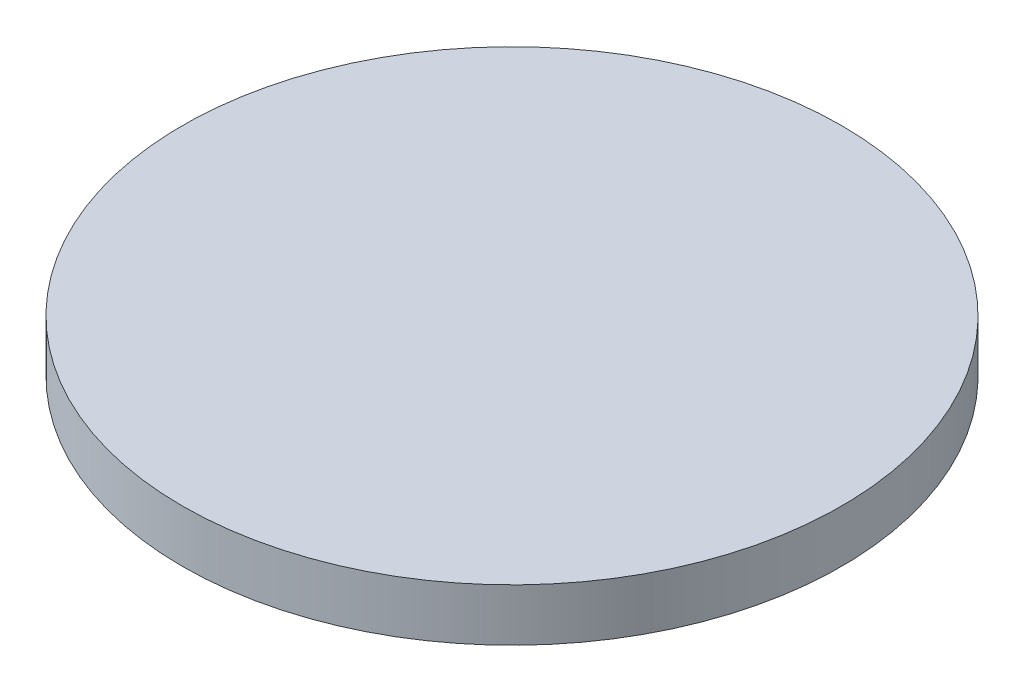
ISO-10303-21;
HEADER;
FILE_DESCRIPTION(('STEP AP214'),'2;1');
FILE_NAME('part.step','',(''),(''),'','','');
FILE_SCHEMA(('AUTOMOTIVE_DESIGN { 1 0 10303 214 1 1 1 1 }'));
ENDSEC;
DATA;
#1=APPLICATION_CONTEXT('core data for automotive mechanical design processes');
#2=APPLICATION_PROTOCOL_DEFINITION('international standard','automotive_design',2000,#1);
#3=PRODUCT_CONTEXT('',#1,'mechanical');
#4=PRODUCT('Part','Part','',(#3));
#5=PRODUCT_RELATED_PRODUCT_CATEGORY('part','',(#4));
#6=PRODUCT_DEFINITION_FORMATION('','',#4);
#7=PRODUCT_DEFINITION_CONTEXT('part definition',#1,'design');
#8=PRODUCT_DEFINITION('design','',#6,#7);
#9=PRODUCT_DEFINITION_SHAPE('','',#8);
#10=(LENGTH_UNIT() NAMED_UNIT(*) SI_UNIT(.MILLI.,.METRE.));
#11=(NAMED_UNIT(*) PLANE_ANGLE_UNIT() SI_UNIT($,.RADIAN.));
#12=(NAMED_UNIT(*) SI_UNIT($,.STERADIAN.) SOLID_ANGLE_UNIT());
#13=UNCERTAINTY_MEASURE_WITH_UNIT(LENGTH_MEASURE(1.E-05),#10,'distance_accuracy_value','');
#14=(GEOMETRIC_REPRESENTATION_CONTEXT(3) GLOBAL_UNCERTAINTY_ASSIGNED_CONTEXT((#13)) GLOBAL_UNIT_ASSIGNED_CONTEXT((#10,
#11,#12)) REPRESENTATION_CONTEXT('',''));
#15=CARTESIAN_POINT('',(0.,0.,0.));
#16=DIRECTION('',(0.,0.,1.));
#17=DIRECTION('',(1.,0.,0.));
#18=AXIS2_PLACEMENT_3D('',#15,#16,#17);
#19=CARTESIAN_POINT('',(0.,6.35,0.));
#20=DIRECTION('',(0.,-1.,0.));
#21=DIRECTION('',(0.,0.,-1.));
#22=AXIS2_PLACEMENT_3D('',#19,#20,#21);
#23=CYLINDRICAL_SURFACE('',#22,40.);
#24=CARTESIAN_POINT('',(0.,6.35,0.));
#25=DIRECTION('',(0.,1.,0.));
#26=DIRECTION('',(0.,0.,1.));
#27=AXIS2_PLACEMENT_3D('',#24,#25,#26);
#28=CIRCLE('',#27,40.);
#29=CARTESIAN_POINT('',(0.,6.35,40.));
#30=VERTEX_POINT('',#29);
#31=EDGE_CURVE('E10',#30,#30,#28,.T.);
#32=ORIENTED_EDGE('',*,*,#31,.F.);
#33=EDGE_LOOP('',(#32));
#34=FACE_BOUND('',#33,.T.);
#35=CARTESIAN_POINT('',(0.,0.,0.));
#36=DIRECTION('',(0.,1.,0.));
#37=DIRECTION('',(0.,0.,1.));
#38=AXIS2_PLACEMENT_3D('',#35,#36,#37);
#39=CIRCLE('',#38,40.);
#40=CARTESIAN_POINT('',(0.,0.,40.));
#41=VERTEX_POINT('',#40);
#42=EDGE_CURVE('E34',#41,#41,#39,.T.);
#43=ORIENTED_EDGE('',*,*,#42,.T.);
#44=EDGE_LOOP('',(#43));
#45=FACE_BOUND('',#44,.T.);
#46=ADVANCED_FACE('F31',(#34,#45),#23,.T.);
#47=CARTESIAN_POINT('',(0.,6.35,0.));
#48=DIRECTION('',(0.,1.,0.));
#49=DIRECTION('',(0.,0.,1.));
#50=AXIS2_PLACEMENT_3D('',#47,#48,#49);
#51=PLANE('',#50);
#52=ORIENTED_EDGE('',*,*,#31,.T.);
#53=EDGE_LOOP('',(#52));
#54=FACE_BOUND('',#53,.T.);
#55=ADVANCED_FACE('F46',(#54),#51,.T.);
#56=CARTESIAN_POINT('',(0.,0.,0.));
#57=DIRECTION('',(0.,1.,0.));
#58=DIRECTION('',(0.,0.,1.));
#59=AXIS2_PLACEMENT_3D('',#56,#57,#58);
#60=PLANE('',#59);
#61=ORIENTED_EDGE('',*,*,#42,.F.);
#62=EDGE_LOOP('',(#61));
#63=FACE_BOUND('',#62,.T.);
#64=ADVANCED_FACE('F44',(#63),#60,.F.);
#65=CLOSED_SHELL('',(#46,#55,#64));
#66=MANIFOLD_SOLID_BREP('B2',#65);
#67=ADVANCED_BREP_SHAPE_REPRESENTATION('',(#18,#66),#14);
#68=SHAPE_DEFINITION_REPRESENTATION(#9,#67);
ENDSEC;
END-ISO-10303-21;
